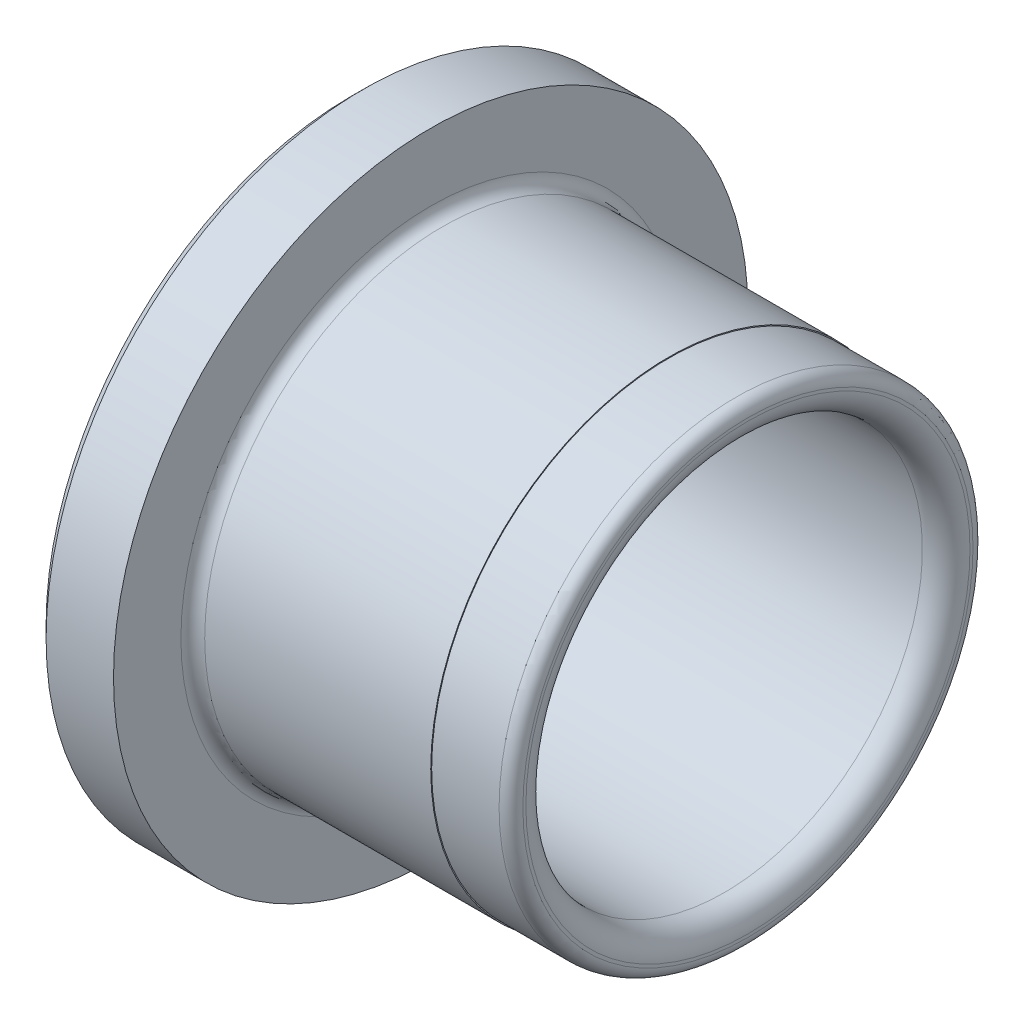
ISO-10303-21;
HEADER;
FILE_DESCRIPTION(('STEP AP214'),'2;1');
FILE_NAME('part.step','',(''),(''),'','','');
FILE_SCHEMA(('AUTOMOTIVE_DESIGN { 1 0 10303 214 1 1 1 1 }'));
ENDSEC;
DATA;
#1=APPLICATION_CONTEXT('core data for automotive mechanical design processes');
#2=APPLICATION_PROTOCOL_DEFINITION('international standard','automotive_design',2000,#1);
#3=PRODUCT_CONTEXT('',#1,'mechanical');
#4=PRODUCT('Part','Part','',(#3));
#5=PRODUCT_RELATED_PRODUCT_CATEGORY('part','',(#4));
#6=PRODUCT_DEFINITION_FORMATION('','',#4);
#7=PRODUCT_DEFINITION_CONTEXT('part definition',#1,'design');
#8=PRODUCT_DEFINITION('design','',#6,#7);
#9=PRODUCT_DEFINITION_SHAPE('','',#8);
#10=(LENGTH_UNIT() NAMED_UNIT(*) SI_UNIT(.MILLI.,.METRE.));
#11=(NAMED_UNIT(*) PLANE_ANGLE_UNIT() SI_UNIT($,.RADIAN.));
#12=(NAMED_UNIT(*) SI_UNIT($,.STERADIAN.) SOLID_ANGLE_UNIT());
#13=UNCERTAINTY_MEASURE_WITH_UNIT(LENGTH_MEASURE(1.E-05),#10,'distance_accuracy_value','');
#14=(GEOMETRIC_REPRESENTATION_CONTEXT(3) GLOBAL_UNCERTAINTY_ASSIGNED_CONTEXT((#13)) GLOBAL_UNIT_ASSIGNED_CONTEXT((#10,
#11,#12)) REPRESENTATION_CONTEXT('',''));
#15=CARTESIAN_POINT('',(0.,0.,0.));
#16=DIRECTION('',(0.,0.,1.));
#17=DIRECTION('',(1.,0.,0.));
#18=AXIS2_PLACEMENT_3D('',#15,#16,#17);
#19=CARTESIAN_POINT('',(0.,-7.91039447397283,-7.7));
#20=DIRECTION('',(-1.,0.,0.));
#21=DIRECTION('',(0.,0.,1.));
#22=AXIS2_PLACEMENT_3D('',#19,#20,#21);
#23=PLANE('',#22);
#24=CARTESIAN_POINT('',(0.,0.,0.));
#25=DIRECTION('',(-1.,0.,0.));
#26=DIRECTION('',(0.,0.,-1.));
#27=AXIS2_PLACEMENT_3D('',#24,#25,#26);
#28=CIRCLE('',#27,7.7);
#29=CARTESIAN_POINT('',(0.,0.,-7.7));
#30=VERTEX_POINT('',#29);
#31=EDGE_CURVE('E77',#30,#30,#28,.F.);
#32=ORIENTED_EDGE('',*,*,#31,.F.);
#33=EDGE_LOOP('',(#32));
#34=FACE_BOUND('',#33,.T.);
#35=CARTESIAN_POINT('',(0.,0.,0.));
#36=DIRECTION('',(1.,0.,0.));
#37=DIRECTION('',(0.,-1.16852023277707E-09,1.));
#38=AXIS2_PLACEMENT_3D('',#35,#36,#37);
#39=CIRCLE('',#38,5.94427723047752);
#40=CARTESIAN_POINT('',(0.,-6.94600821304905E-09,5.94427723047752));
#41=VERTEX_POINT('',#40);
#42=EDGE_CURVE('E73',#41,#41,#39,.T.);
#43=ORIENTED_EDGE('',*,*,#42,.T.);
#44=EDGE_LOOP('',(#43));
#45=FACE_BOUND('',#44,.T.);
#46=ADVANCED_FACE('F14',(#34,#45),#23,.T.);
#47=CARTESIAN_POINT('',(10.,-5.676,5.676));
#48=DIRECTION('',(1.,0.,0.));
#49=DIRECTION('',(0.,0.,-1.));
#50=AXIS2_PLACEMENT_3D('',#47,#48,#49);
#51=PLANE('',#50);
#52=CARTESIAN_POINT('',(10.,0.,0.));
#53=DIRECTION('',(1.,0.,0.));
#54=DIRECTION('',(0.,0.,1.));
#55=AXIS2_PLACEMENT_3D('',#52,#53,#54);
#56=CIRCLE('',#55,5.676);
#57=CARTESIAN_POINT('',(10.,0.,5.676));
#58=VERTEX_POINT('',#57);
#59=EDGE_CURVE('E69',#58,#58,#56,.T.);
#60=ORIENTED_EDGE('',*,*,#59,.T.);
#61=EDGE_LOOP('',(#60));
#62=FACE_BOUND('',#61,.T.);
#63=CARTESIAN_POINT('',(10.,0.,0.));
#64=DIRECTION('',(-1.,0.,0.));
#65=DIRECTION('',(0.,0.,-1.));
#66=AXIS2_PLACEMENT_3D('',#63,#64,#65);
#67=CIRCLE('',#66,5.6);
#68=CARTESIAN_POINT('',(10.,0.,-5.6));
#69=VERTEX_POINT('',#68);
#70=EDGE_CURVE('E65',#69,#69,#67,.F.);
#71=ORIENTED_EDGE('',*,*,#70,.F.);
#72=EDGE_LOOP('',(#71));
#73=FACE_BOUND('',#72,.T.);
#74=ADVANCED_FACE('F87',(#62,#73),#51,.T.);
#75=CARTESIAN_POINT('',(8.,-6.16394374595285,6.));
#76=DIRECTION('',(1.,0.,0.));
#77=DIRECTION('',(0.,0.,-1.));
#78=AXIS2_PLACEMENT_3D('',#75,#76,#77);
#79=PLANE('',#78);
#80=CARTESIAN_POINT('',(8.,0.,0.));
#81=DIRECTION('',(1.,0.,0.));
#82=DIRECTION('',(0.,0.,1.));
#83=AXIS2_PLACEMENT_3D('',#80,#81,#82);
#84=CIRCLE('',#83,6.);
#85=CARTESIAN_POINT('',(8.,0.,6.));
#86=VERTEX_POINT('',#85);
#87=EDGE_CURVE('E61',#86,#86,#84,.T.);
#88=ORIENTED_EDGE('',*,*,#87,.T.);
#89=EDGE_LOOP('',(#88));
#90=FACE_BOUND('',#89,.T.);
#91=CARTESIAN_POINT('',(8.,0.,0.));
#92=DIRECTION('',(-1.,0.,0.));
#93=DIRECTION('',(0.,0.,-1.));
#94=AXIS2_PLACEMENT_3D('',#91,#92,#93);
#95=CIRCLE('',#94,5.976);
#96=CARTESIAN_POINT('',(8.,0.,-5.976));
#97=VERTEX_POINT('',#96);
#98=EDGE_CURVE('E57',#97,#97,#95,.F.);
#99=ORIENTED_EDGE('',*,*,#98,.F.);
#100=EDGE_LOOP('',(#99));
#101=FACE_BOUND('',#100,.T.);
#102=ADVANCED_FACE('F105',(#90,#101),#79,.T.);
#103=CARTESIAN_POINT('',(2.,-8.21859166127046,8.));
#104=DIRECTION('',(1.,0.,0.));
#105=DIRECTION('',(0.,0.,-1.));
#106=AXIS2_PLACEMENT_3D('',#103,#104,#105);
#107=PLANE('',#106);
#108=CARTESIAN_POINT('',(2.,0.,0.));
#109=DIRECTION('',(1.,0.,0.));
#110=DIRECTION('',(0.,0.,1.));
#111=AXIS2_PLACEMENT_3D('',#108,#109,#110);
#112=CIRCLE('',#111,8.);
#113=CARTESIAN_POINT('',(2.,0.,8.));
#114=VERTEX_POINT('',#113);
#115=EDGE_CURVE('E53',#114,#114,#112,.T.);
#116=ORIENTED_EDGE('',*,*,#115,.T.);
#117=EDGE_LOOP('',(#116));
#118=FACE_BOUND('',#117,.T.);
#119=CARTESIAN_POINT('',(2.,0.,0.));
#120=DIRECTION('',(-1.,0.,0.));
#121=DIRECTION('',(0.,0.,-1.));
#122=AXIS2_PLACEMENT_3D('',#119,#120,#121);
#123=CIRCLE('',#122,6.30000003462705);
#124=CARTESIAN_POINT('',(2.,0.,-6.30000003462705));
#125=VERTEX_POINT('',#124);
#126=EDGE_CURVE('E49',#125,#125,#123,.F.);
#127=ORIENTED_EDGE('',*,*,#126,.F.);
#128=EDGE_LOOP('',(#127));
#129=FACE_BOUND('',#128,.T.);
#130=ADVANCED_FACE('F94',(#118,#129),#107,.T.);
#131=CARTESIAN_POINT('',(0.59999999999999,0.,0.));
#132=DIRECTION('',(1.,0.,0.));
#133=DIRECTION('',(0.,0.,1.));
#134=AXIS2_PLACEMENT_3D('',#131,#132,#133);
#135=TOROIDAL_SURFACE('',#134,5.94427723047752,0.59999999999999);
#136=CARTESIAN_POINT('',(0.495811093399842,0.,0.));
#137=DIRECTION('',(1.,0.,0.));
#138=DIRECTION('',(0.,0.,1.));
#139=AXIS2_PLACEMENT_3D('',#136,#137,#138);
#140=CIRCLE('',#139,5.3533925786702);
#141=CARTESIAN_POINT('',(0.495811093399842,0.,5.3533925786702));
#142=VERTEX_POINT('',#141);
#143=EDGE_CURVE('E45',#142,#142,#140,.T.);
#144=ORIENTED_EDGE('',*,*,#143,.T.);
#145=EDGE_LOOP('',(#144));
#146=FACE_BOUND('',#145,.T.);
#147=ORIENTED_EDGE('',*,*,#42,.F.);
#148=EDGE_LOOP('',(#147));
#149=FACE_BOUND('',#148,.T.);
#150=ADVANCED_FACE('F91',(#146,#149),#135,.T.);
#151=CARTESIAN_POINT('',(0.495811093399841,0.,0.));
#152=DIRECTION('',(-1.,0.,0.));
#153=DIRECTION('',(0.,0.,-1.));
#154=AXIS2_PLACEMENT_3D('',#151,#152,#153);
#155=CONICAL_SURFACE('',#154,5.3533925786702,0.174532925199433);
#156=ORIENTED_EDGE('',*,*,#143,.F.);
#157=EDGE_LOOP('',(#156));
#158=FACE_BOUND('',#157,.T.);
#159=CARTESIAN_POINT('',(2.5,0.,0.));
#160=DIRECTION('',(1.,0.,0.));
#161=DIRECTION('',(0.,0.,1.));
#162=AXIS2_PLACEMENT_3D('',#159,#160,#161);
#163=CIRCLE('',#162,4.99999999999999);
#164=CARTESIAN_POINT('',(2.5,0.,4.99999999999999));
#165=VERTEX_POINT('',#164);
#166=EDGE_CURVE('E41',#165,#165,#163,.T.);
#167=ORIENTED_EDGE('',*,*,#166,.T.);
#168=EDGE_LOOP('',(#167));
#169=FACE_BOUND('',#168,.T.);
#170=ADVANCED_FACE('F93',(#158,#169),#155,.F.);
#171=CARTESIAN_POINT('',(10.,0.,0.));
#172=DIRECTION('',(1.,0.,0.));
#173=DIRECTION('',(0.,0.,1.));
#174=AXIS2_PLACEMENT_3D('',#171,#172,#173);
#175=CYLINDRICAL_SURFACE('',#174,5.);
#176=CARTESIAN_POINT('',(9.4,0.,0.));
#177=DIRECTION('',(1.,0.,0.));
#178=DIRECTION('',(0.,0.,1.));
#179=AXIS2_PLACEMENT_3D('',#176,#177,#178);
#180=CIRCLE('',#179,5.);
#181=CARTESIAN_POINT('',(9.4,0.,5.));
#182=VERTEX_POINT('',#181);
#183=EDGE_CURVE('E35',#182,#182,#180,.T.);
#184=ORIENTED_EDGE('',*,*,#183,.T.);
#185=EDGE_LOOP('',(#184));
#186=FACE_BOUND('',#185,.T.);
#187=ORIENTED_EDGE('',*,*,#166,.F.);
#188=EDGE_LOOP('',(#187));
#189=FACE_BOUND('',#188,.T.);
#190=ADVANCED_FACE('F102',(#186,#189),#175,.F.);
#191=CARTESIAN_POINT('',(9.3999999999999,0.,0.));
#192=DIRECTION('',(1.,0.,0.));
#193=DIRECTION('',(0.,0.,1.));
#194=AXIS2_PLACEMENT_3D('',#191,#192,#193);
#195=TOROIDAL_SURFACE('',#194,5.6000000000001,0.600000000000098);
#196=ORIENTED_EDGE('',*,*,#70,.T.);
#197=EDGE_LOOP('',(#196));
#198=FACE_BOUND('',#197,.T.);
#199=ORIENTED_EDGE('',*,*,#183,.F.);
#200=EDGE_LOOP('',(#199));
#201=FACE_BOUND('',#200,.T.);
#202=ADVANCED_FACE('F112',(#198,#201),#195,.T.);
#203=CARTESIAN_POINT('',(9.70000000000012,0.,0.));
#204=DIRECTION('',(1.,0.,0.));
#205=DIRECTION('',(0.,0.,1.));
#206=AXIS2_PLACEMENT_3D('',#203,#204,#205);
#207=TOROIDAL_SURFACE('',#206,5.67600000000013,0.299999999999877);
#208=CARTESIAN_POINT('',(9.70000000000012,0.,0.));
#209=DIRECTION('',(1.,0.,0.));
#210=DIRECTION('',(0.,0.,1.));
#211=AXIS2_PLACEMENT_3D('',#208,#209,#210);
#212=CIRCLE('',#211,5.97600000000001);
#213=CARTESIAN_POINT('',(9.70000000000012,0.,5.97600000000001));
#214=VERTEX_POINT('',#213);
#215=EDGE_CURVE('E29',#214,#214,#212,.T.);
#216=ORIENTED_EDGE('',*,*,#215,.T.);
#217=EDGE_LOOP('',(#216));
#218=FACE_BOUND('',#217,.T.);
#219=ORIENTED_EDGE('',*,*,#59,.F.);
#220=EDGE_LOOP('',(#219));
#221=FACE_BOUND('',#220,.T.);
#222=ADVANCED_FACE('F116',(#218,#221),#207,.T.);
#223=CARTESIAN_POINT('',(10.,0.,0.));
#224=DIRECTION('',(1.,0.,0.));
#225=DIRECTION('',(0.,0.,1.));
#226=AXIS2_PLACEMENT_3D('',#223,#224,#225);
#227=CYLINDRICAL_SURFACE('',#226,5.976);
#228=ORIENTED_EDGE('',*,*,#98,.T.);
#229=EDGE_LOOP('',(#228));
#230=FACE_BOUND('',#229,.T.);
#231=ORIENTED_EDGE('',*,*,#215,.F.);
#232=EDGE_LOOP('',(#231));
#233=FACE_BOUND('',#232,.T.);
#234=ADVANCED_FACE('F120',(#230,#233),#227,.T.);
#235=CARTESIAN_POINT('',(10.,0.,0.));
#236=DIRECTION('',(1.,0.,0.));
#237=DIRECTION('',(0.,0.,1.));
#238=AXIS2_PLACEMENT_3D('',#235,#236,#237);
#239=CYLINDRICAL_SURFACE('',#238,6.);
#240=CARTESIAN_POINT('',(2.3,0.,0.));
#241=DIRECTION('',(1.,0.,0.));
#242=DIRECTION('',(0.,0.,1.));
#243=AXIS2_PLACEMENT_3D('',#240,#241,#242);
#244=CIRCLE('',#243,6.);
#245=CARTESIAN_POINT('',(2.3,0.,6.));
#246=VERTEX_POINT('',#245);
#247=EDGE_CURVE('E22',#246,#246,#244,.T.);
#248=ORIENTED_EDGE('',*,*,#247,.T.);
#249=EDGE_LOOP('',(#248));
#250=FACE_BOUND('',#249,.T.);
#251=ORIENTED_EDGE('',*,*,#87,.F.);
#252=EDGE_LOOP('',(#251));
#253=FACE_BOUND('',#252,.T.);
#254=ADVANCED_FACE('F124',(#250,#253),#239,.T.);
#255=CARTESIAN_POINT('',(2.29999999999988,0.,0.));
#256=DIRECTION('',(1.,0.,0.));
#257=DIRECTION('',(0.,0.,1.));
#258=AXIS2_PLACEMENT_3D('',#255,#256,#257);
#259=TOROIDAL_SURFACE('',#258,6.29999999999988,0.299999999999877);
#260=ORIENTED_EDGE('',*,*,#126,.T.);
#261=EDGE_LOOP('',(#260));
#262=FACE_BOUND('',#261,.T.);
#263=ORIENTED_EDGE('',*,*,#247,.F.);
#264=EDGE_LOOP('',(#263));
#265=FACE_BOUND('',#264,.T.);
#266=ADVANCED_FACE('F128',(#262,#265),#259,.F.);
#267=CARTESIAN_POINT('',(10.,0.,0.));
#268=DIRECTION('',(1.,0.,0.));
#269=DIRECTION('',(0.,0.,1.));
#270=AXIS2_PLACEMENT_3D('',#267,#268,#269);
#271=CYLINDRICAL_SURFACE('',#270,8.);
#272=CARTESIAN_POINT('',(0.300000000000001,0.,0.));
#273=DIRECTION('',(1.,0.,0.));
#274=DIRECTION('',(0.,0.,1.));
#275=AXIS2_PLACEMENT_3D('',#272,#273,#274);
#276=CIRCLE('',#275,8.);
#277=CARTESIAN_POINT('',(0.300000000000001,0.,8.));
#278=VERTEX_POINT('',#277);
#279=EDGE_CURVE('E9',#278,#278,#276,.T.);
#280=ORIENTED_EDGE('',*,*,#279,.T.);
#281=EDGE_LOOP('',(#280));
#282=FACE_BOUND('',#281,.T.);
#283=ORIENTED_EDGE('',*,*,#115,.F.);
#284=EDGE_LOOP('',(#283));
#285=FACE_BOUND('',#284,.T.);
#286=ADVANCED_FACE('F130',(#282,#285),#271,.T.);
#287=CARTESIAN_POINT('',(0.3,0.,0.));
#288=DIRECTION('',(1.,0.,0.));
#289=DIRECTION('',(0.,0.,1.));
#290=AXIS2_PLACEMENT_3D('',#287,#288,#289);
#291=CONICAL_SURFACE('',#290,8.,0.785398163397447);
#292=ORIENTED_EDGE('',*,*,#31,.T.);
#293=EDGE_LOOP('',(#292));
#294=FACE_BOUND('',#293,.T.);
#295=ORIENTED_EDGE('',*,*,#279,.F.);
#296=EDGE_LOOP('',(#295));
#297=FACE_BOUND('',#296,.T.);
#298=ADVANCED_FACE('F16',(#294,#297),#291,.T.);
#299=CLOSED_SHELL('',(#46,#74,#102,#130,#150,#170,#190,#202,#222,#234,#254,#266,#286,#298));
#300=MANIFOLD_SOLID_BREP('B1',#299);
#301=ADVANCED_BREP_SHAPE_REPRESENTATION('',(#18,#300),#14);
#302=SHAPE_DEFINITION_REPRESENTATION(#9,#301);
ENDSEC;
END-ISO-10303-21;
